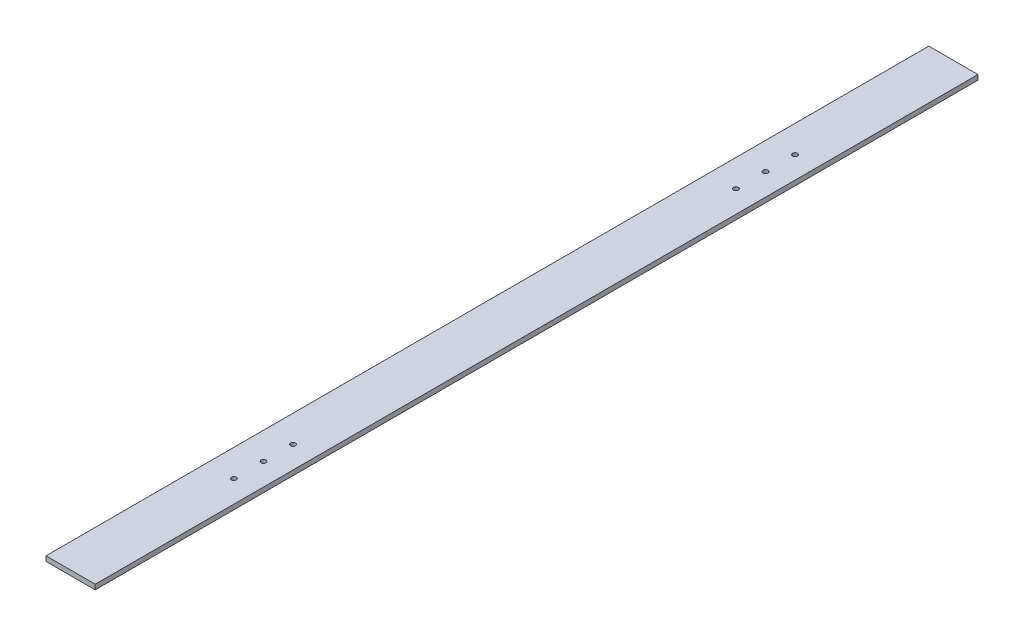
ISO-10303-21;
HEADER;
FILE_DESCRIPTION(('STEP AP214'),'2;1');
FILE_NAME('part.step','',(''),(''),'','','');
FILE_SCHEMA(('AUTOMOTIVE_DESIGN { 1 0 10303 214 1 1 1 1 }'));
ENDSEC;
DATA;
#1=APPLICATION_CONTEXT('core data for automotive mechanical design processes');
#2=APPLICATION_PROTOCOL_DEFINITION('international standard','automotive_design',2000,#1);
#3=PRODUCT_CONTEXT('',#1,'mechanical');
#4=PRODUCT('Part','Part','',(#3));
#5=PRODUCT_RELATED_PRODUCT_CATEGORY('part','',(#4));
#6=PRODUCT_DEFINITION_FORMATION('','',#4);
#7=PRODUCT_DEFINITION_CONTEXT('part definition',#1,'design');
#8=PRODUCT_DEFINITION('design','',#6,#7);
#9=PRODUCT_DEFINITION_SHAPE('','',#8);
#10=(LENGTH_UNIT() NAMED_UNIT(*) SI_UNIT(.MILLI.,.METRE.));
#11=(NAMED_UNIT(*) PLANE_ANGLE_UNIT() SI_UNIT($,.RADIAN.));
#12=(NAMED_UNIT(*) SI_UNIT($,.STERADIAN.) SOLID_ANGLE_UNIT());
#13=UNCERTAINTY_MEASURE_WITH_UNIT(LENGTH_MEASURE(1.E-05),#10,'distance_accuracy_value','');
#14=(GEOMETRIC_REPRESENTATION_CONTEXT(3) GLOBAL_UNCERTAINTY_ASSIGNED_CONTEXT((#13)) GLOBAL_UNIT_ASSIGNED_CONTEXT((#10,
#11,#12)) REPRESENTATION_CONTEXT('',''));
#15=CARTESIAN_POINT('',(0.,0.,0.));
#16=DIRECTION('',(0.,0.,1.));
#17=DIRECTION('',(1.,0.,0.));
#18=AXIS2_PLACEMENT_3D('',#15,#16,#17);
#19=CARTESIAN_POINT('',(0.,288.5,0.));
#20=DIRECTION('',(0.,1.,0.));
#21=DIRECTION('',(0.,0.,1.));
#22=AXIS2_PLACEMENT_3D('',#19,#20,#21);
#23=PLANE('',#22);
#24=DIRECTION('',(0.,0.,-1.));
#25=VECTOR('',#24,1.);
#26=CARTESIAN_POINT('',(-197.5,288.5,898.5));
#27=LINE('',#26,#25);
#28=CARTESIAN_POINT('',(-197.5,288.5,1.49999999999995));
#29=VERTEX_POINT('',#28);
#30=CARTESIAN_POINT('',(-197.5,288.5,898.5));
#31=VERTEX_POINT('',#30);
#32=EDGE_CURVE('E93',#29,#31,#27,.F.);
#33=ORIENTED_EDGE('',*,*,#32,.T.);
#34=DIRECTION('',(-1.,0.,0.));
#35=VECTOR('',#34,1.);
#36=CARTESIAN_POINT('',(-147.5,288.5,898.5));
#37=LINE('',#36,#35);
#38=CARTESIAN_POINT('',(-147.5,288.5,898.5));
#39=VERTEX_POINT('',#38);
#40=EDGE_CURVE('E91',#31,#39,#37,.F.);
#41=ORIENTED_EDGE('',*,*,#40,.T.);
#42=DIRECTION('',(0.,0.,1.));
#43=VECTOR('',#42,1.);
#44=CARTESIAN_POINT('',(-147.5,288.5,898.5));
#45=LINE('',#44,#43);
#46=CARTESIAN_POINT('',(-147.5,288.5,1.49999999999995));
#47=VERTEX_POINT('',#46);
#48=EDGE_CURVE('E87',#39,#47,#45,.F.);
#49=ORIENTED_EDGE('',*,*,#48,.T.);
#50=DIRECTION('',(1.,0.,0.));
#51=VECTOR('',#50,1.);
#52=CARTESIAN_POINT('',(-147.5,288.5,1.49999999999995));
#53=LINE('',#52,#51);
#54=EDGE_CURVE('E312',#47,#29,#53,.F.);
#55=ORIENTED_EDGE('',*,*,#54,.T.);
#56=EDGE_LOOP('',(#33,#41,#49,#55));
#57=FACE_BOUND('',#56,.T.);
#58=CARTESIAN_POINT('',(-170.,288.5,735.));
#59=DIRECTION('',(0.,1.,0.));
#60=DIRECTION('',(0.,0.,1.));
#61=AXIS2_PLACEMENT_3D('',#58,#59,#60);
#62=CIRCLE('',#61,2.49999999999995);
#63=CARTESIAN_POINT('',(-170.,288.5,737.5));
#64=VERTEX_POINT('',#63);
#65=EDGE_CURVE('E99',#64,#64,#62,.F.);
#66=ORIENTED_EDGE('',*,*,#65,.T.);
#67=EDGE_LOOP('',(#66));
#68=FACE_BOUND('',#67,.T.);
#69=CARTESIAN_POINT('',(-170.,288.5,705.));
#70=DIRECTION('',(0.,1.,0.));
#71=DIRECTION('',(0.,0.,1.));
#72=AXIS2_PLACEMENT_3D('',#69,#70,#71);
#73=CIRCLE('',#72,2.49999999999995);
#74=CARTESIAN_POINT('',(-170.,288.5,707.5));
#75=VERTEX_POINT('',#74);
#76=EDGE_CURVE('E135',#75,#75,#73,.F.);
#77=ORIENTED_EDGE('',*,*,#76,.T.);
#78=EDGE_LOOP('',(#77));
#79=FACE_BOUND('',#78,.T.);
#80=CARTESIAN_POINT('',(-170.,288.5,675.));
#81=DIRECTION('',(0.,1.,0.));
#82=DIRECTION('',(0.,0.,1.));
#83=AXIS2_PLACEMENT_3D('',#80,#81,#82);
#84=CIRCLE('',#83,2.49999999999995);
#85=CARTESIAN_POINT('',(-170.,288.5,677.5));
#86=VERTEX_POINT('',#85);
#87=EDGE_CURVE('E138',#86,#86,#84,.F.);
#88=ORIENTED_EDGE('',*,*,#87,.T.);
#89=EDGE_LOOP('',(#88));
#90=FACE_BOUND('',#89,.T.);
#91=CARTESIAN_POINT('',(-170.,288.5,225.));
#92=DIRECTION('',(0.,1.,0.));
#93=DIRECTION('',(0.,0.,1.));
#94=AXIS2_PLACEMENT_3D('',#91,#92,#93);
#95=CIRCLE('',#94,2.49999999999992);
#96=CARTESIAN_POINT('',(-170.,288.5,227.5));
#97=VERTEX_POINT('',#96);
#98=EDGE_CURVE('E141',#97,#97,#95,.F.);
#99=ORIENTED_EDGE('',*,*,#98,.T.);
#100=EDGE_LOOP('',(#99));
#101=FACE_BOUND('',#100,.T.);
#102=CARTESIAN_POINT('',(-170.,288.5,195.));
#103=DIRECTION('',(0.,1.,0.));
#104=DIRECTION('',(0.,0.,1.));
#105=AXIS2_PLACEMENT_3D('',#102,#103,#104);
#106=CIRCLE('',#105,2.49999999999995);
#107=CARTESIAN_POINT('',(-170.,288.5,197.5));
#108=VERTEX_POINT('',#107);
#109=EDGE_CURVE('E143',#108,#108,#106,.F.);
#110=ORIENTED_EDGE('',*,*,#109,.T.);
#111=EDGE_LOOP('',(#110));
#112=FACE_BOUND('',#111,.T.);
#113=CARTESIAN_POINT('',(-170.,288.5,165.));
#114=DIRECTION('',(0.,1.,0.));
#115=DIRECTION('',(0.,0.,1.));
#116=AXIS2_PLACEMENT_3D('',#113,#114,#115);
#117=CIRCLE('',#116,2.49999999999992);
#118=CARTESIAN_POINT('',(-170.,288.5,167.5));
#119=VERTEX_POINT('',#118);
#120=EDGE_CURVE('E45',#119,#119,#117,.F.);
#121=ORIENTED_EDGE('',*,*,#120,.T.);
#122=EDGE_LOOP('',(#121));
#123=FACE_BOUND('',#122,.T.);
#124=ADVANCED_FACE('F42',(#57,#68,#79,#90,#101,#112,#123),#23,.T.);
#125=CARTESIAN_POINT('',(-170.,290.,165.));
#126=DIRECTION('',(0.,1.,0.));
#127=DIRECTION('',(0.,0.,1.));
#128=AXIS2_PLACEMENT_3D('',#125,#126,#127);
#129=CYLINDRICAL_SURFACE('',#128,2.49999999999992);
#130=ORIENTED_EDGE('',*,*,#120,.F.);
#131=EDGE_LOOP('',(#130));
#132=FACE_BOUND('',#131,.T.);
#133=CARTESIAN_POINT('',(-170.,283.5,165.));
#134=DIRECTION('',(0.,1.,0.));
#135=DIRECTION('',(0.,0.,1.));
#136=AXIS2_PLACEMENT_3D('',#133,#134,#135);
#137=CIRCLE('',#136,2.49999999999992);
#138=CARTESIAN_POINT('',(-170.,283.5,167.5));
#139=VERTEX_POINT('',#138);
#140=EDGE_CURVE('E129',#139,#139,#137,.F.);
#141=ORIENTED_EDGE('',*,*,#140,.T.);
#142=EDGE_LOOP('',(#141));
#143=FACE_BOUND('',#142,.T.);
#144=ADVANCED_FACE('F151',(#132,#143),#129,.F.);
#145=CARTESIAN_POINT('',(-170.,290.,195.));
#146=DIRECTION('',(0.,1.,0.));
#147=DIRECTION('',(0.,0.,1.));
#148=AXIS2_PLACEMENT_3D('',#145,#146,#147);
#149=CYLINDRICAL_SURFACE('',#148,2.49999999999995);
#150=ORIENTED_EDGE('',*,*,#109,.F.);
#151=EDGE_LOOP('',(#150));
#152=FACE_BOUND('',#151,.T.);
#153=CARTESIAN_POINT('',(-170.,283.5,195.));
#154=DIRECTION('',(0.,1.,0.));
#155=DIRECTION('',(0.,0.,1.));
#156=AXIS2_PLACEMENT_3D('',#153,#154,#155);
#157=CIRCLE('',#156,2.49999999999995);
#158=CARTESIAN_POINT('',(-170.,283.5,197.5));
#159=VERTEX_POINT('',#158);
#160=EDGE_CURVE('E126',#159,#159,#157,.F.);
#161=ORIENTED_EDGE('',*,*,#160,.T.);
#162=EDGE_LOOP('',(#161));
#163=FACE_BOUND('',#162,.T.);
#164=ADVANCED_FACE('F154',(#152,#163),#149,.F.);
#165=CARTESIAN_POINT('',(-170.,290.,225.));
#166=DIRECTION('',(0.,1.,0.));
#167=DIRECTION('',(0.,0.,1.));
#168=AXIS2_PLACEMENT_3D('',#165,#166,#167);
#169=CYLINDRICAL_SURFACE('',#168,2.49999999999992);
#170=ORIENTED_EDGE('',*,*,#98,.F.);
#171=EDGE_LOOP('',(#170));
#172=FACE_BOUND('',#171,.T.);
#173=CARTESIAN_POINT('',(-170.,283.5,225.));
#174=DIRECTION('',(0.,1.,0.));
#175=DIRECTION('',(0.,0.,1.));
#176=AXIS2_PLACEMENT_3D('',#173,#174,#175);
#177=CIRCLE('',#176,2.49999999999992);
#178=CARTESIAN_POINT('',(-170.,283.5,227.5));
#179=VERTEX_POINT('',#178);
#180=EDGE_CURVE('E123',#179,#179,#177,.F.);
#181=ORIENTED_EDGE('',*,*,#180,.T.);
#182=EDGE_LOOP('',(#181));
#183=FACE_BOUND('',#182,.T.);
#184=ADVANCED_FACE('F188',(#172,#183),#169,.F.);
#185=CARTESIAN_POINT('',(-170.,290.,675.));
#186=DIRECTION('',(0.,1.,0.));
#187=DIRECTION('',(0.,0.,1.));
#188=AXIS2_PLACEMENT_3D('',#185,#186,#187);
#189=CYLINDRICAL_SURFACE('',#188,2.49999999999995);
#190=ORIENTED_EDGE('',*,*,#87,.F.);
#191=EDGE_LOOP('',(#190));
#192=FACE_BOUND('',#191,.T.);
#193=CARTESIAN_POINT('',(-170.,283.5,675.));
#194=DIRECTION('',(0.,1.,0.));
#195=DIRECTION('',(0.,0.,1.));
#196=AXIS2_PLACEMENT_3D('',#193,#194,#195);
#197=CIRCLE('',#196,2.49999999999995);
#198=CARTESIAN_POINT('',(-170.,283.5,677.5));
#199=VERTEX_POINT('',#198);
#200=EDGE_CURVE('E120',#199,#199,#197,.F.);
#201=ORIENTED_EDGE('',*,*,#200,.T.);
#202=EDGE_LOOP('',(#201));
#203=FACE_BOUND('',#202,.T.);
#204=ADVANCED_FACE('F184',(#192,#203),#189,.F.);
#205=CARTESIAN_POINT('',(-170.,290.,705.));
#206=DIRECTION('',(0.,1.,0.));
#207=DIRECTION('',(0.,0.,1.));
#208=AXIS2_PLACEMENT_3D('',#205,#206,#207);
#209=CYLINDRICAL_SURFACE('',#208,2.49999999999995);
#210=ORIENTED_EDGE('',*,*,#76,.F.);
#211=EDGE_LOOP('',(#210));
#212=FACE_BOUND('',#211,.T.);
#213=CARTESIAN_POINT('',(-170.,283.5,705.));
#214=DIRECTION('',(0.,1.,0.));
#215=DIRECTION('',(0.,0.,1.));
#216=AXIS2_PLACEMENT_3D('',#213,#214,#215);
#217=CIRCLE('',#216,2.49999999999995);
#218=CARTESIAN_POINT('',(-170.,283.5,707.5));
#219=VERTEX_POINT('',#218);
#220=EDGE_CURVE('E117',#219,#219,#217,.F.);
#221=ORIENTED_EDGE('',*,*,#220,.T.);
#222=EDGE_LOOP('',(#221));
#223=FACE_BOUND('',#222,.T.);
#224=ADVANCED_FACE('F180',(#212,#223),#209,.F.);
#225=CARTESIAN_POINT('',(-170.,290.,735.));
#226=DIRECTION('',(0.,1.,0.));
#227=DIRECTION('',(0.,0.,1.));
#228=AXIS2_PLACEMENT_3D('',#225,#226,#227);
#229=CYLINDRICAL_SURFACE('',#228,2.49999999999995);
#230=ORIENTED_EDGE('',*,*,#65,.F.);
#231=EDGE_LOOP('',(#230));
#232=FACE_BOUND('',#231,.T.);
#233=CARTESIAN_POINT('',(-170.,283.5,735.));
#234=DIRECTION('',(0.,1.,0.));
#235=DIRECTION('',(0.,0.,1.));
#236=AXIS2_PLACEMENT_3D('',#233,#234,#235);
#237=CIRCLE('',#236,2.49999999999995);
#238=CARTESIAN_POINT('',(-170.,283.5,737.5));
#239=VERTEX_POINT('',#238);
#240=EDGE_CURVE('E114',#239,#239,#237,.F.);
#241=ORIENTED_EDGE('',*,*,#240,.T.);
#242=EDGE_LOOP('',(#241));
#243=FACE_BOUND('',#242,.T.);
#244=ADVANCED_FACE('F177',(#232,#243),#229,.F.);
#245=CARTESIAN_POINT('',(-147.5,283.5,898.5));
#246=DIRECTION('',(0.,0.,-1.));
#247=DIRECTION('',(-1.,0.,0.));
#248=AXIS2_PLACEMENT_3D('',#245,#246,#247);
#249=PLANE('',#248);
#250=DIRECTION('',(0.,1.,0.));
#251=VECTOR('',#250,1.);
#252=CARTESIAN_POINT('',(-147.5,283.5,898.5));
#253=LINE('',#252,#251);
#254=CARTESIAN_POINT('',(-147.5,283.5,898.5));
#255=VERTEX_POINT('',#254);
#256=EDGE_CURVE('E98',#255,#39,#253,.T.);
#257=ORIENTED_EDGE('',*,*,#256,.T.);
#258=ORIENTED_EDGE('',*,*,#40,.F.);
#259=DIRECTION('',(0.,1.,0.));
#260=VECTOR('',#259,1.);
#261=CARTESIAN_POINT('',(-197.5,283.5,898.5));
#262=LINE('',#261,#260);
#263=CARTESIAN_POINT('',(-197.5,283.5,898.5));
#264=VERTEX_POINT('',#263);
#265=EDGE_CURVE('E132',#31,#264,#262,.F.);
#266=ORIENTED_EDGE('',*,*,#265,.T.);
#267=DIRECTION('',(1.,0.,0.));
#268=VECTOR('',#267,1.);
#269=CARTESIAN_POINT('',(0.,283.5,898.5));
#270=LINE('',#269,#268);
#271=EDGE_CURVE('E110',#264,#255,#270,.T.);
#272=ORIENTED_EDGE('',*,*,#271,.T.);
#273=EDGE_LOOP('',(#257,#258,#266,#272));
#274=FACE_BOUND('',#273,.T.);
#275=ADVANCED_FACE('F109',(#274),#249,.F.);
#276=CARTESIAN_POINT('',(-147.5,283.5,898.5));
#277=DIRECTION('',(-1.,0.,0.));
#278=DIRECTION('',(0.,0.,1.));
#279=AXIS2_PLACEMENT_3D('',#276,#277,#278);
#280=PLANE('',#279);
#281=DIRECTION('',(0.,1.,0.));
#282=VECTOR('',#281,1.);
#283=CARTESIAN_POINT('',(-147.5,283.5,1.49999999999995));
#284=LINE('',#283,#282);
#285=CARTESIAN_POINT('',(-147.5,283.5,1.49999999999995));
#286=VERTEX_POINT('',#285);
#287=EDGE_CURVE('E106',#286,#47,#284,.T.);
#288=ORIENTED_EDGE('',*,*,#287,.T.);
#289=ORIENTED_EDGE('',*,*,#48,.F.);
#290=ORIENTED_EDGE('',*,*,#256,.F.);
#291=DIRECTION('',(0.,0.,1.));
#292=VECTOR('',#291,1.);
#293=CARTESIAN_POINT('',(-147.5,283.5,0.));
#294=LINE('',#293,#292);
#295=EDGE_CURVE('E319',#255,#286,#294,.F.);
#296=ORIENTED_EDGE('',*,*,#295,.T.);
#297=EDGE_LOOP('',(#288,#289,#290,#296));
#298=FACE_BOUND('',#297,.T.);
#299=ADVANCED_FACE('F103',(#298),#280,.F.);
#300=CARTESIAN_POINT('',(-147.5,283.5,1.49999999999995));
#301=DIRECTION('',(0.,0.,1.));
#302=DIRECTION('',(1.,0.,0.));
#303=AXIS2_PLACEMENT_3D('',#300,#301,#302);
#304=PLANE('',#303);
#305=DIRECTION('',(0.,1.,0.));
#306=VECTOR('',#305,1.);
#307=CARTESIAN_POINT('',(-197.5,283.5,1.49999999999995));
#308=LINE('',#307,#306);
#309=CARTESIAN_POINT('',(-197.5,283.5,1.49999999999995));
#310=VERTEX_POINT('',#309);
#311=EDGE_CURVE('E59',#310,#29,#308,.T.);
#312=ORIENTED_EDGE('',*,*,#311,.T.);
#313=ORIENTED_EDGE('',*,*,#54,.F.);
#314=ORIENTED_EDGE('',*,*,#287,.F.);
#315=DIRECTION('',(1.,0.,0.));
#316=VECTOR('',#315,1.);
#317=CARTESIAN_POINT('',(0.,283.5,1.49999999999995));
#318=LINE('',#317,#316);
#319=EDGE_CURVE('E51',#286,#310,#318,.F.);
#320=ORIENTED_EDGE('',*,*,#319,.T.);
#321=EDGE_LOOP('',(#312,#313,#314,#320));
#322=FACE_BOUND('',#321,.T.);
#323=ADVANCED_FACE('F165',(#322),#304,.F.);
#324=CARTESIAN_POINT('',(-197.5,283.5,898.5));
#325=DIRECTION('',(1.,0.,0.));
#326=DIRECTION('',(0.,0.,-1.));
#327=AXIS2_PLACEMENT_3D('',#324,#325,#326);
#328=PLANE('',#327);
#329=ORIENTED_EDGE('',*,*,#265,.F.);
#330=ORIENTED_EDGE('',*,*,#32,.F.);
#331=ORIENTED_EDGE('',*,*,#311,.F.);
#332=DIRECTION('',(0.,0.,1.));
#333=VECTOR('',#332,1.);
#334=CARTESIAN_POINT('',(-197.5,283.5,0.));
#335=LINE('',#334,#333);
#336=EDGE_CURVE('E11',#310,#264,#335,.T.);
#337=ORIENTED_EDGE('',*,*,#336,.T.);
#338=EDGE_LOOP('',(#329,#330,#331,#337));
#339=FACE_BOUND('',#338,.T.);
#340=ADVANCED_FACE('F159',(#339),#328,.F.);
#341=CARTESIAN_POINT('',(0.,283.5,0.));
#342=DIRECTION('',(0.,1.,0.));
#343=DIRECTION('',(0.,0.,1.));
#344=AXIS2_PLACEMENT_3D('',#341,#342,#343);
#345=PLANE('',#344);
#346=ORIENTED_EDGE('',*,*,#319,.F.);
#347=ORIENTED_EDGE('',*,*,#295,.F.);
#348=ORIENTED_EDGE('',*,*,#271,.F.);
#349=ORIENTED_EDGE('',*,*,#336,.F.);
#350=EDGE_LOOP('',(#346,#347,#348,#349));
#351=FACE_BOUND('',#350,.T.);
#352=ORIENTED_EDGE('',*,*,#240,.F.);
#353=EDGE_LOOP('',(#352));
#354=FACE_BOUND('',#353,.T.);
#355=ORIENTED_EDGE('',*,*,#220,.F.);
#356=EDGE_LOOP('',(#355));
#357=FACE_BOUND('',#356,.T.);
#358=ORIENTED_EDGE('',*,*,#200,.F.);
#359=EDGE_LOOP('',(#358));
#360=FACE_BOUND('',#359,.T.);
#361=ORIENTED_EDGE('',*,*,#180,.F.);
#362=EDGE_LOOP('',(#361));
#363=FACE_BOUND('',#362,.T.);
#364=ORIENTED_EDGE('',*,*,#160,.F.);
#365=EDGE_LOOP('',(#364));
#366=FACE_BOUND('',#365,.T.);
#367=ORIENTED_EDGE('',*,*,#140,.F.);
#368=EDGE_LOOP('',(#367));
#369=FACE_BOUND('',#368,.T.);
#370=ADVANCED_FACE('F157',(#351,#354,#357,#360,#363,#366,#369),#345,.F.);
#371=CLOSED_SHELL('',(#124,#144,#164,#184,#204,#224,#244,#275,#299,#323,#340,#370));
#372=MANIFOLD_SOLID_BREP('B2',#371);
#373=ADVANCED_BREP_SHAPE_REPRESENTATION('',(#18,#372),#14);
#374=SHAPE_DEFINITION_REPRESENTATION(#9,#373);
ENDSEC;
END-ISO-10303-21;
